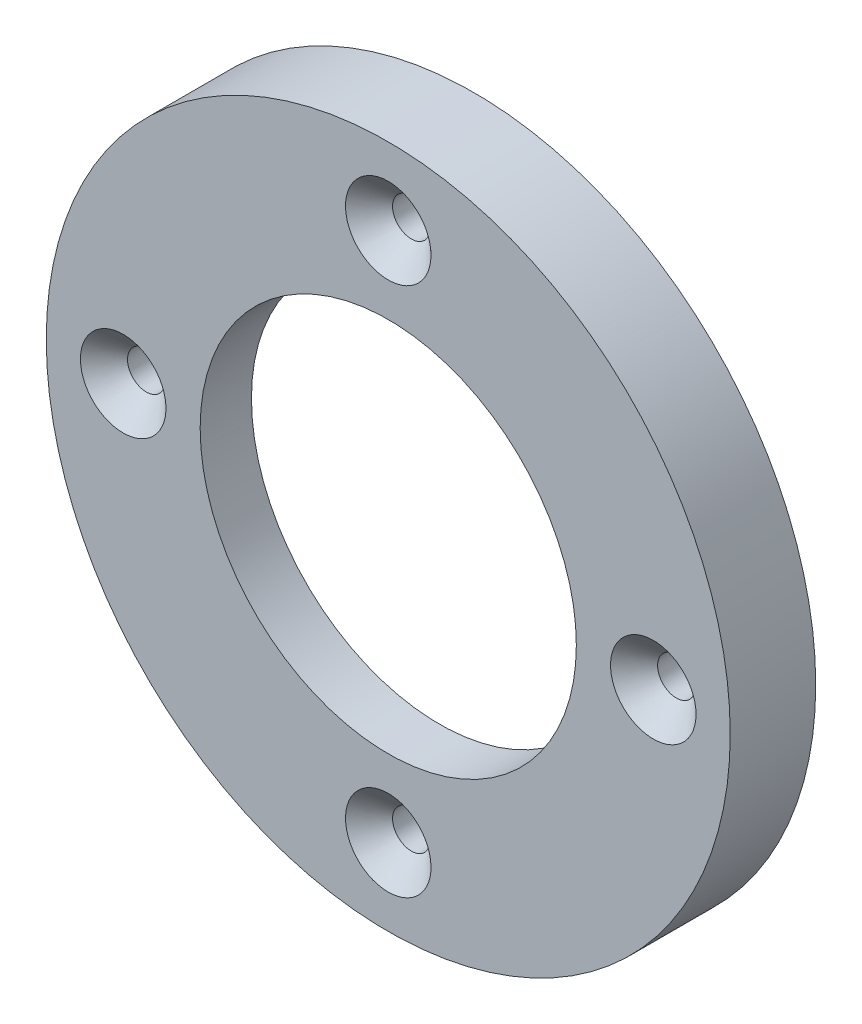
ISO-10303-21;
HEADER;
FILE_DESCRIPTION(('STEP AP214'),'2;1');
FILE_NAME('part.step','',(''),(''),'','','');
FILE_SCHEMA(('AUTOMOTIVE_DESIGN { 1 0 10303 214 1 1 1 1 }'));
ENDSEC;
DATA;
#1=APPLICATION_CONTEXT('core data for automotive mechanical design processes');
#2=APPLICATION_PROTOCOL_DEFINITION('international standard','automotive_design',2000,#1);
#3=PRODUCT_CONTEXT('',#1,'mechanical');
#4=PRODUCT('Part','Part','',(#3));
#5=PRODUCT_RELATED_PRODUCT_CATEGORY('part','',(#4));
#6=PRODUCT_DEFINITION_FORMATION('','',#4);
#7=PRODUCT_DEFINITION_CONTEXT('part definition',#1,'design');
#8=PRODUCT_DEFINITION('design','',#6,#7);
#9=PRODUCT_DEFINITION_SHAPE('','',#8);
#10=(LENGTH_UNIT() NAMED_UNIT(*) SI_UNIT(.MILLI.,.METRE.));
#11=(NAMED_UNIT(*) PLANE_ANGLE_UNIT() SI_UNIT($,.RADIAN.));
#12=(NAMED_UNIT(*) SI_UNIT($,.STERADIAN.) SOLID_ANGLE_UNIT());
#13=UNCERTAINTY_MEASURE_WITH_UNIT(LENGTH_MEASURE(1.E-05),#10,'distance_accuracy_value','');
#14=(GEOMETRIC_REPRESENTATION_CONTEXT(3) GLOBAL_UNCERTAINTY_ASSIGNED_CONTEXT((#13)) GLOBAL_UNIT_ASSIGNED_CONTEXT((#10,
#11,#12)) REPRESENTATION_CONTEXT('',''));
#15=CARTESIAN_POINT('',(0.,0.,0.));
#16=DIRECTION('',(0.,0.,1.));
#17=DIRECTION('',(1.,0.,0.));
#18=AXIS2_PLACEMENT_3D('',#15,#16,#17);
#19=CARTESIAN_POINT('',(0.,0.,3.));
#20=DIRECTION('',(0.,0.,1.));
#21=DIRECTION('',(1.,0.,0.));
#22=AXIS2_PLACEMENT_3D('',#19,#20,#21);
#23=PLANE('',#22);
#24=CARTESIAN_POINT('',(-1.62353882256206E-13,15.5,3.));
#25=DIRECTION('',(0.,0.,-1.));
#26=DIRECTION('',(0.,1.,0.));
#27=AXIS2_PLACEMENT_3D('',#24,#25,#26);
#28=CIRCLE('',#27,2.5);
#29=CARTESIAN_POINT('',(-1.88539992297529E-13,18.,3.));
#30=VERTEX_POINT('',#29);
#31=EDGE_CURVE('E99',#30,#30,#28,.T.);
#32=ORIENTED_EDGE('',*,*,#31,.T.);
#33=EDGE_LOOP('',(#32));
#34=FACE_BOUND('',#33,.T.);
#35=CARTESIAN_POINT('',(15.5,0.,3.));
#36=DIRECTION('',(0.,0.,-1.));
#37=DIRECTION('',(1.,0.,0.));
#38=AXIS2_PLACEMENT_3D('',#35,#36,#37);
#39=CIRCLE('',#38,2.5);
#40=CARTESIAN_POINT('',(18.,0.,3.));
#41=VERTEX_POINT('',#40);
#42=EDGE_CURVE('E58',#41,#41,#39,.T.);
#43=ORIENTED_EDGE('',*,*,#42,.T.);
#44=EDGE_LOOP('',(#43));
#45=FACE_BOUND('',#44,.T.);
#46=CARTESIAN_POINT('',(0.,-15.5,3.));
#47=DIRECTION('',(0.,0.,-1.));
#48=DIRECTION('',(0.,-1.,0.));
#49=AXIS2_PLACEMENT_3D('',#46,#47,#48);
#50=CIRCLE('',#49,2.5);
#51=CARTESIAN_POINT('',(0.,-18.,3.));
#52=VERTEX_POINT('',#51);
#53=EDGE_CURVE('E63',#52,#52,#50,.T.);
#54=ORIENTED_EDGE('',*,*,#53,.T.);
#55=EDGE_LOOP('',(#54));
#56=FACE_BOUND('',#55,.T.);
#57=CARTESIAN_POINT('',(-15.5,0.,3.));
#58=DIRECTION('',(0.,0.,-1.));
#59=DIRECTION('',(-1.,0.,0.));
#60=AXIS2_PLACEMENT_3D('',#57,#58,#59);
#61=CIRCLE('',#60,2.5);
#62=CARTESIAN_POINT('',(-18.,0.,3.));
#63=VERTEX_POINT('',#62);
#64=EDGE_CURVE('E68',#63,#63,#61,.T.);
#65=ORIENTED_EDGE('',*,*,#64,.T.);
#66=EDGE_LOOP('',(#65));
#67=FACE_BOUND('',#66,.T.);
#68=CARTESIAN_POINT('',(0.,0.,3.));
#69=DIRECTION('',(0.,0.,1.));
#70=DIRECTION('',(1.,0.,0.));
#71=AXIS2_PLACEMENT_3D('',#68,#69,#70);
#72=CIRCLE('',#71,11.);
#73=CARTESIAN_POINT('',(11.,0.,3.));
#74=VERTEX_POINT('',#73);
#75=EDGE_CURVE('E75',#74,#74,#72,.T.);
#76=ORIENTED_EDGE('',*,*,#75,.F.);
#77=EDGE_LOOP('',(#76));
#78=FACE_BOUND('',#77,.T.);
#79=CARTESIAN_POINT('',(0.,0.,3.));
#80=DIRECTION('',(0.,0.,1.));
#81=DIRECTION('',(1.,0.,0.));
#82=AXIS2_PLACEMENT_3D('',#79,#80,#81);
#83=CIRCLE('',#82,20.);
#84=CARTESIAN_POINT('',(20.,0.,3.));
#85=VERTEX_POINT('',#84);
#86=EDGE_CURVE('E72',#85,#85,#83,.T.);
#87=ORIENTED_EDGE('',*,*,#86,.T.);
#88=EDGE_LOOP('',(#87));
#89=FACE_BOUND('',#88,.T.);
#90=ADVANCED_FACE('F37',(#34,#45,#56,#67,#78,#89),#23,.T.);
#91=CARTESIAN_POINT('',(0.,0.,0.));
#92=DIRECTION('',(0.,0.,1.));
#93=DIRECTION('',(1.,0.,0.));
#94=AXIS2_PLACEMENT_3D('',#91,#92,#93);
#95=PLANE('',#94);
#96=CARTESIAN_POINT('',(-1.62353882256206E-13,15.5,0.));
#97=DIRECTION('',(0.,0.,1.));
#98=DIRECTION('',(1.,0.,0.));
#99=AXIS2_PLACEMENT_3D('',#96,#97,#98);
#100=CIRCLE('',#99,1.1);
#101=CARTESIAN_POINT('',(1.09999999999984,15.5,0.));
#102=VERTEX_POINT('',#101);
#103=EDGE_CURVE('E55',#102,#102,#100,.T.);
#104=ORIENTED_EDGE('',*,*,#103,.T.);
#105=EDGE_LOOP('',(#104));
#106=FACE_BOUND('',#105,.T.);
#107=CARTESIAN_POINT('',(15.5,0.,0.));
#108=DIRECTION('',(0.,0.,1.));
#109=DIRECTION('',(1.,0.,0.));
#110=AXIS2_PLACEMENT_3D('',#107,#108,#109);
#111=CIRCLE('',#110,1.1);
#112=CARTESIAN_POINT('',(16.6,0.,0.));
#113=VERTEX_POINT('',#112);
#114=EDGE_CURVE('E60',#113,#113,#111,.T.);
#115=ORIENTED_EDGE('',*,*,#114,.T.);
#116=EDGE_LOOP('',(#115));
#117=FACE_BOUND('',#116,.T.);
#118=CARTESIAN_POINT('',(0.,-15.5,0.));
#119=DIRECTION('',(0.,0.,1.));
#120=DIRECTION('',(1.,0.,0.));
#121=AXIS2_PLACEMENT_3D('',#118,#119,#120);
#122=CIRCLE('',#121,1.1);
#123=CARTESIAN_POINT('',(1.10000000000006,-15.5,0.));
#124=VERTEX_POINT('',#123);
#125=EDGE_CURVE('E65',#124,#124,#122,.T.);
#126=ORIENTED_EDGE('',*,*,#125,.T.);
#127=EDGE_LOOP('',(#126));
#128=FACE_BOUND('',#127,.T.);
#129=CARTESIAN_POINT('',(-15.5,0.,0.));
#130=DIRECTION('',(0.,0.,1.));
#131=DIRECTION('',(1.,0.,0.));
#132=AXIS2_PLACEMENT_3D('',#129,#130,#131);
#133=CIRCLE('',#132,1.1);
#134=CARTESIAN_POINT('',(-14.4,0.,0.));
#135=VERTEX_POINT('',#134);
#136=EDGE_CURVE('E70',#135,#135,#133,.T.);
#137=ORIENTED_EDGE('',*,*,#136,.T.);
#138=EDGE_LOOP('',(#137));
#139=FACE_BOUND('',#138,.T.);
#140=CARTESIAN_POINT('',(0.,0.,0.));
#141=DIRECTION('',(0.,0.,1.));
#142=DIRECTION('',(1.,0.,0.));
#143=AXIS2_PLACEMENT_3D('',#140,#141,#142);
#144=CIRCLE('',#143,11.);
#145=CARTESIAN_POINT('',(11.,0.,0.));
#146=VERTEX_POINT('',#145);
#147=EDGE_CURVE('E52',#146,#146,#144,.T.);
#148=ORIENTED_EDGE('',*,*,#147,.T.);
#149=EDGE_LOOP('',(#148));
#150=FACE_BOUND('',#149,.T.);
#151=CARTESIAN_POINT('',(0.,0.,0.));
#152=DIRECTION('',(0.,0.,1.));
#153=DIRECTION('',(1.,0.,0.));
#154=AXIS2_PLACEMENT_3D('',#151,#152,#153);
#155=CIRCLE('',#154,18.);
#156=CARTESIAN_POINT('',(18.,0.,0.));
#157=VERTEX_POINT('',#156);
#158=EDGE_CURVE('E48',#157,#157,#155,.T.);
#159=ORIENTED_EDGE('',*,*,#158,.F.);
#160=EDGE_LOOP('',(#159));
#161=FACE_BOUND('',#160,.T.);
#162=ADVANCED_FACE('F118',(#106,#117,#128,#139,#150,#161),#95,.F.);
#163=CARTESIAN_POINT('',(0.,0.,0.));
#164=DIRECTION('',(0.,0.,1.));
#165=DIRECTION('',(1.,0.,0.));
#166=AXIS2_PLACEMENT_3D('',#163,#164,#165);
#167=CYLINDRICAL_SURFACE('',#166,11.);
#168=ORIENTED_EDGE('',*,*,#147,.F.);
#169=EDGE_LOOP('',(#168));
#170=FACE_BOUND('',#169,.T.);
#171=ORIENTED_EDGE('',*,*,#75,.T.);
#172=EDGE_LOOP('',(#171));
#173=FACE_BOUND('',#172,.T.);
#174=ADVANCED_FACE('F121',(#170,#173),#167,.F.);
#175=CARTESIAN_POINT('',(0.,0.,-2.));
#176=DIRECTION('',(0.,0.,1.));
#177=DIRECTION('',(1.,0.,0.));
#178=AXIS2_PLACEMENT_3D('',#175,#176,#177);
#179=CYLINDRICAL_SURFACE('',#178,18.);
#180=CARTESIAN_POINT('',(0.,0.,-1.49999999999999));
#181=DIRECTION('',(0.,0.,1.));
#182=DIRECTION('',(1.,0.,0.));
#183=AXIS2_PLACEMENT_3D('',#180,#181,#182);
#184=CIRCLE('',#183,18.);
#185=CARTESIAN_POINT('',(18.,0.,-1.49999999999999));
#186=VERTEX_POINT('',#185);
#187=EDGE_CURVE('E10',#186,#186,#184,.F.);
#188=ORIENTED_EDGE('',*,*,#187,.T.);
#189=EDGE_LOOP('',(#188));
#190=FACE_BOUND('',#189,.T.);
#191=ORIENTED_EDGE('',*,*,#158,.T.);
#192=EDGE_LOOP('',(#191));
#193=FACE_BOUND('',#192,.T.);
#194=ADVANCED_FACE('F132',(#190,#193),#179,.F.);
#195=CARTESIAN_POINT('',(0.,0.,-2.));
#196=DIRECTION('',(0.,0.,1.));
#197=DIRECTION('',(1.,0.,0.));
#198=AXIS2_PLACEMENT_3D('',#195,#196,#197);
#199=CYLINDRICAL_SURFACE('',#198,20.);
#200=CARTESIAN_POINT('',(0.,0.,-2.));
#201=DIRECTION('',(0.,0.,1.));
#202=DIRECTION('',(1.,0.,0.));
#203=AXIS2_PLACEMENT_3D('',#200,#201,#202);
#204=CIRCLE('',#203,20.);
#205=CARTESIAN_POINT('',(20.,0.,-2.));
#206=VERTEX_POINT('',#205);
#207=EDGE_CURVE('E78',#206,#206,#204,.T.);
#208=ORIENTED_EDGE('',*,*,#207,.T.);
#209=EDGE_LOOP('',(#208));
#210=FACE_BOUND('',#209,.T.);
#211=ORIENTED_EDGE('',*,*,#86,.F.);
#212=EDGE_LOOP('',(#211));
#213=FACE_BOUND('',#212,.T.);
#214=ADVANCED_FACE('F134',(#210,#213),#199,.T.);
#215=CARTESIAN_POINT('',(0.,0.,-2.));
#216=DIRECTION('',(0.,0.,1.));
#217=DIRECTION('',(1.,0.,0.));
#218=AXIS2_PLACEMENT_3D('',#215,#216,#217);
#219=PLANE('',#218);
#220=CARTESIAN_POINT('',(0.,0.,-2.));
#221=DIRECTION('',(0.,0.,1.));
#222=DIRECTION('',(1.,0.,0.));
#223=AXIS2_PLACEMENT_3D('',#220,#221,#222);
#224=CIRCLE('',#223,18.5);
#225=CARTESIAN_POINT('',(18.5,0.,-2.));
#226=VERTEX_POINT('',#225);
#227=EDGE_CURVE('E44',#226,#226,#224,.T.);
#228=ORIENTED_EDGE('',*,*,#227,.T.);
#229=EDGE_LOOP('',(#228));
#230=FACE_BOUND('',#229,.T.);
#231=ORIENTED_EDGE('',*,*,#207,.F.);
#232=EDGE_LOOP('',(#231));
#233=FACE_BOUND('',#232,.T.);
#234=ADVANCED_FACE('F141',(#230,#233),#219,.F.);
#235=CARTESIAN_POINT('',(-15.5,0.,-24.0808517995533));
#236=DIRECTION('',(0.,0.,-1.));
#237=DIRECTION('',(-1.,0.,0.));
#238=AXIS2_PLACEMENT_3D('',#235,#236,#237);
#239=CYLINDRICAL_SURFACE('',#238,1.1);
#240=CARTESIAN_POINT('',(-15.5,0.,1.64803571527008));
#241=DIRECTION('',(0.,0.,-1.));
#242=DIRECTION('',(-1.,0.,0.));
#243=AXIS2_PLACEMENT_3D('',#240,#241,#242);
#244=CIRCLE('',#243,1.1);
#245=CARTESIAN_POINT('',(-16.6,0.,1.64803571527008));
#246=VERTEX_POINT('',#245);
#247=EDGE_CURVE('E73',#246,#246,#244,.T.);
#248=ORIENTED_EDGE('',*,*,#247,.F.);
#249=EDGE_LOOP('',(#248));
#250=FACE_BOUND('',#249,.T.);
#251=ORIENTED_EDGE('',*,*,#136,.F.);
#252=EDGE_LOOP('',(#251));
#253=FACE_BOUND('',#252,.T.);
#254=ADVANCED_FACE('F154',(#250,#253),#239,.F.);
#255=CARTESIAN_POINT('',(-15.5,0.,1.64803571527008));
#256=DIRECTION('',(0.,0.,1.));
#257=DIRECTION('',(1.,0.,0.));
#258=AXIS2_PLACEMENT_3D('',#255,#256,#257);
#259=CONICAL_SURFACE('',#258,1.1,0.802851455917386);
#260=ORIENTED_EDGE('',*,*,#64,.F.);
#261=EDGE_LOOP('',(#260));
#262=FACE_BOUND('',#261,.T.);
#263=ORIENTED_EDGE('',*,*,#247,.T.);
#264=EDGE_LOOP('',(#263));
#265=FACE_BOUND('',#264,.T.);
#266=ADVANCED_FACE('F159',(#262,#265),#259,.F.);
#267=CARTESIAN_POINT('',(0.,-15.5,-24.0808517995533));
#268=DIRECTION('',(0.,0.,-1.));
#269=DIRECTION('',(0.,-1.,0.));
#270=AXIS2_PLACEMENT_3D('',#267,#268,#269);
#271=CYLINDRICAL_SURFACE('',#270,1.1);
#272=CARTESIAN_POINT('',(0.,-15.5,1.64803571527008));
#273=DIRECTION('',(0.,0.,-1.));
#274=DIRECTION('',(0.,-1.,0.));
#275=AXIS2_PLACEMENT_3D('',#272,#273,#274);
#276=CIRCLE('',#275,1.1);
#277=CARTESIAN_POINT('',(0.,-16.6,1.64803571527008));
#278=VERTEX_POINT('',#277);
#279=EDGE_CURVE('E69',#278,#278,#276,.T.);
#280=ORIENTED_EDGE('',*,*,#279,.F.);
#281=EDGE_LOOP('',(#280));
#282=FACE_BOUND('',#281,.T.);
#283=ORIENTED_EDGE('',*,*,#125,.F.);
#284=EDGE_LOOP('',(#283));
#285=FACE_BOUND('',#284,.T.);
#286=ADVANCED_FACE('F169',(#282,#285),#271,.F.);
#287=CARTESIAN_POINT('',(0.,-15.5,1.64803571527008));
#288=DIRECTION('',(0.,0.,1.));
#289=DIRECTION('',(0.,1.,0.));
#290=AXIS2_PLACEMENT_3D('',#287,#288,#289);
#291=CONICAL_SURFACE('',#290,1.1,0.802851455917386);
#292=ORIENTED_EDGE('',*,*,#53,.F.);
#293=EDGE_LOOP('',(#292));
#294=FACE_BOUND('',#293,.T.);
#295=ORIENTED_EDGE('',*,*,#279,.T.);
#296=EDGE_LOOP('',(#295));
#297=FACE_BOUND('',#296,.T.);
#298=ADVANCED_FACE('F177',(#294,#297),#291,.F.);
#299=CARTESIAN_POINT('',(15.5,0.,-24.0808517995533));
#300=DIRECTION('',(0.,0.,-1.));
#301=DIRECTION('',(1.,0.,0.));
#302=AXIS2_PLACEMENT_3D('',#299,#300,#301);
#303=CYLINDRICAL_SURFACE('',#302,1.1);
#304=CARTESIAN_POINT('',(15.5,0.,1.64803571527008));
#305=DIRECTION('',(0.,0.,-1.));
#306=DIRECTION('',(1.,0.,0.));
#307=AXIS2_PLACEMENT_3D('',#304,#305,#306);
#308=CIRCLE('',#307,1.1);
#309=CARTESIAN_POINT('',(16.6,0.,1.64803571527008));
#310=VERTEX_POINT('',#309);
#311=EDGE_CURVE('E64',#310,#310,#308,.T.);
#312=ORIENTED_EDGE('',*,*,#311,.F.);
#313=EDGE_LOOP('',(#312));
#314=FACE_BOUND('',#313,.T.);
#315=ORIENTED_EDGE('',*,*,#114,.F.);
#316=EDGE_LOOP('',(#315));
#317=FACE_BOUND('',#316,.T.);
#318=ADVANCED_FACE('F181',(#314,#317),#303,.F.);
#319=CARTESIAN_POINT('',(15.5,0.,1.64803571527008));
#320=DIRECTION('',(0.,0.,1.));
#321=DIRECTION('',(-1.,0.,0.));
#322=AXIS2_PLACEMENT_3D('',#319,#320,#321);
#323=CONICAL_SURFACE('',#322,1.1,0.802851455917386);
#324=ORIENTED_EDGE('',*,*,#42,.F.);
#325=EDGE_LOOP('',(#324));
#326=FACE_BOUND('',#325,.T.);
#327=ORIENTED_EDGE('',*,*,#311,.T.);
#328=EDGE_LOOP('',(#327));
#329=FACE_BOUND('',#328,.T.);
#330=ADVANCED_FACE('F114',(#326,#329),#323,.F.);
#331=CARTESIAN_POINT('',(-1.62353882256206E-13,15.5,-24.0808517995533));
#332=DIRECTION('',(0.,0.,-1.));
#333=DIRECTION('',(0.,1.,0.));
#334=AXIS2_PLACEMENT_3D('',#331,#332,#333);
#335=CYLINDRICAL_SURFACE('',#334,1.1);
#336=CARTESIAN_POINT('',(-1.62353882256206E-13,15.5,1.64803571527008));
#337=DIRECTION('',(0.,0.,-1.));
#338=DIRECTION('',(0.,1.,0.));
#339=AXIS2_PLACEMENT_3D('',#336,#337,#338);
#340=CIRCLE('',#339,1.1);
#341=CARTESIAN_POINT('',(-1.73875770674388E-13,16.6,1.64803571527008));
#342=VERTEX_POINT('',#341);
#343=EDGE_CURVE('E59',#342,#342,#340,.T.);
#344=ORIENTED_EDGE('',*,*,#343,.F.);
#345=EDGE_LOOP('',(#344));
#346=FACE_BOUND('',#345,.T.);
#347=ORIENTED_EDGE('',*,*,#103,.F.);
#348=EDGE_LOOP('',(#347));
#349=FACE_BOUND('',#348,.T.);
#350=ADVANCED_FACE('F108',(#346,#349),#335,.F.);
#351=CARTESIAN_POINT('',(-1.62353882256206E-13,15.5,1.64803571527008));
#352=DIRECTION('',(0.,0.,1.));
#353=DIRECTION('',(0.,-1.,0.));
#354=AXIS2_PLACEMENT_3D('',#351,#352,#353);
#355=CONICAL_SURFACE('',#354,1.1,0.802851455917386);
#356=ORIENTED_EDGE('',*,*,#31,.F.);
#357=EDGE_LOOP('',(#356));
#358=FACE_BOUND('',#357,.T.);
#359=ORIENTED_EDGE('',*,*,#343,.T.);
#360=EDGE_LOOP('',(#359));
#361=FACE_BOUND('',#360,.T.);
#362=ADVANCED_FACE('F105',(#358,#361),#355,.F.);
#363=CARTESIAN_POINT('',(0.,0.,-2.));
#364=DIRECTION('',(0.,0.,-1.));
#365=DIRECTION('',(-1.,0.,0.));
#366=AXIS2_PLACEMENT_3D('',#363,#364,#365);
#367=CONICAL_SURFACE('',#366,18.5,0.785398163397441);
#368=ORIENTED_EDGE('',*,*,#187,.F.);
#369=EDGE_LOOP('',(#368));
#370=FACE_BOUND('',#369,.T.);
#371=ORIENTED_EDGE('',*,*,#227,.F.);
#372=EDGE_LOOP('',(#371));
#373=FACE_BOUND('',#372,.T.);
#374=ADVANCED_FACE('F39',(#370,#373),#367,.F.);
#375=CLOSED_SHELL('',(#90,#162,#174,#194,#214,#234,#254,#266,#286,#298,#318,#330,#350,#362,#374));
#376=MANIFOLD_SOLID_BREP('B2',#375);
#377=ADVANCED_BREP_SHAPE_REPRESENTATION('',(#18,#376),#14);
#378=SHAPE_DEFINITION_REPRESENTATION(#9,#377);
ENDSEC;
END-ISO-10303-21;
